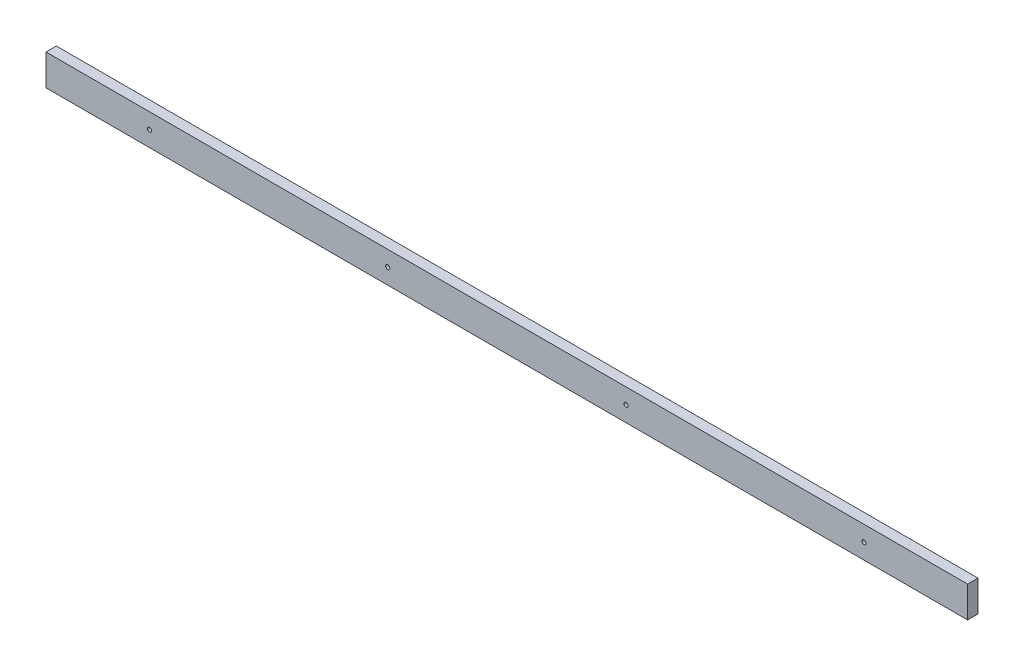
ISO-10303-21;
HEADER;
FILE_DESCRIPTION(('STEP AP214'),'2;1');
FILE_NAME('part.step','',(''),(''),'','','');
FILE_SCHEMA(('AUTOMOTIVE_DESIGN { 1 0 10303 214 1 1 1 1 }'));
ENDSEC;
DATA;
#1=APPLICATION_CONTEXT('core data for automotive mechanical design processes');
#2=APPLICATION_PROTOCOL_DEFINITION('international standard','automotive_design',2000,#1);
#3=PRODUCT_CONTEXT('',#1,'mechanical');
#4=PRODUCT('Part','Part','',(#3));
#5=PRODUCT_RELATED_PRODUCT_CATEGORY('part','',(#4));
#6=PRODUCT_DEFINITION_FORMATION('','',#4);
#7=PRODUCT_DEFINITION_CONTEXT('part definition',#1,'design');
#8=PRODUCT_DEFINITION('design','',#6,#7);
#9=PRODUCT_DEFINITION_SHAPE('','',#8);
#10=(LENGTH_UNIT() NAMED_UNIT(*) SI_UNIT(.MILLI.,.METRE.));
#11=(NAMED_UNIT(*) PLANE_ANGLE_UNIT() SI_UNIT($,.RADIAN.));
#12=(NAMED_UNIT(*) SI_UNIT($,.STERADIAN.) SOLID_ANGLE_UNIT());
#13=UNCERTAINTY_MEASURE_WITH_UNIT(LENGTH_MEASURE(1.E-05),#10,'distance_accuracy_value','');
#14=(GEOMETRIC_REPRESENTATION_CONTEXT(3) GLOBAL_UNCERTAINTY_ASSIGNED_CONTEXT((#13)) GLOBAL_UNIT_ASSIGNED_CONTEXT((#10,
#11,#12)) REPRESENTATION_CONTEXT('',''));
#15=CARTESIAN_POINT('',(0.,0.,0.));
#16=DIRECTION('',(0.,0.,1.));
#17=DIRECTION('',(1.,0.,0.));
#18=AXIS2_PLACEMENT_3D('',#15,#16,#17);
#19=CARTESIAN_POINT('',(890.000000000011,29.9999999999999,9.99999999999999));
#20=DIRECTION('',(-1.00000000000001,0.,0.));
#21=DIRECTION('',(0.,0.,1.));
#22=AXIS2_PLACEMENT_3D('',#19,#20,#21);
#23=PLANE('',#22);
#24=DIRECTION('',(0.,1.00000000000001,0.));
#25=VECTOR('',#24,1.);
#26=CARTESIAN_POINT('',(890.000000000011,29.9999999999999,-10.));
#27=LINE('',#26,#25);
#28=CARTESIAN_POINT('',(890.000000000013,-29.9999999999973,-10.));
#29=VERTEX_POINT('',#28);
#30=CARTESIAN_POINT('',(890.000000000011,29.9999999999999,-10.));
#31=VERTEX_POINT('',#30);
#32=EDGE_CURVE('E97',#29,#31,#27,.T.);
#33=ORIENTED_EDGE('',*,*,#32,.T.);
#34=DIRECTION('',(0.,0.,-1.));
#35=VECTOR('',#34,1.);
#36=CARTESIAN_POINT('',(890.000000000011,29.9999999999999,9.99999999999999));
#37=LINE('',#36,#35);
#38=CARTESIAN_POINT('',(890.000000000011,29.9999999999999,9.99999999999999));
#39=VERTEX_POINT('',#38);
#40=EDGE_CURVE('E11',#39,#31,#37,.T.);
#41=ORIENTED_EDGE('',*,*,#40,.F.);
#42=DIRECTION('',(0.,1.00000000000001,0.));
#43=VECTOR('',#42,1.);
#44=CARTESIAN_POINT('',(890.000000000011,29.9999999999999,9.99999999999999));
#45=LINE('',#44,#43);
#46=CARTESIAN_POINT('',(890.000000000013,-29.9999999999973,9.99999999999999));
#47=VERTEX_POINT('',#46);
#48=EDGE_CURVE('E85',#47,#39,#45,.T.);
#49=ORIENTED_EDGE('',*,*,#48,.F.);
#50=DIRECTION('',(0.,0.,-1.));
#51=VECTOR('',#50,1.);
#52=CARTESIAN_POINT('',(890.000000000013,-29.9999999999973,9.99999999999999));
#53=LINE('',#52,#51);
#54=EDGE_CURVE('E93',#47,#29,#53,.T.);
#55=ORIENTED_EDGE('',*,*,#54,.T.);
#56=EDGE_LOOP('',(#33,#41,#49,#55));
#57=FACE_BOUND('',#56,.T.);
#58=ADVANCED_FACE('F34',(#57),#23,.F.);
#59=CARTESIAN_POINT('',(-890.000000000013,30.,9.99999999999999));
#60=DIRECTION('',(0.,-1.00000000000001,0.));
#61=DIRECTION('',(0.,0.,-1.));
#62=AXIS2_PLACEMENT_3D('',#59,#60,#61);
#63=PLANE('',#62);
#64=DIRECTION('',(-1.00000000000001,0.,0.));
#65=VECTOR('',#64,1.);
#66=CARTESIAN_POINT('',(-890.000000000013,30.,-10.));
#67=LINE('',#66,#65);
#68=CARTESIAN_POINT('',(-890.000000000013,30.,-10.));
#69=VERTEX_POINT('',#68);
#70=EDGE_CURVE('E89',#31,#69,#67,.T.);
#71=ORIENTED_EDGE('',*,*,#70,.T.);
#72=DIRECTION('',(0.,0.,-1.));
#73=VECTOR('',#72,1.);
#74=CARTESIAN_POINT('',(-890.000000000013,30.,9.99999999999999));
#75=LINE('',#74,#73);
#76=CARTESIAN_POINT('',(-890.000000000013,30.,9.99999999999999));
#77=VERTEX_POINT('',#76);
#78=EDGE_CURVE('E42',#77,#69,#75,.T.);
#79=ORIENTED_EDGE('',*,*,#78,.F.);
#80=DIRECTION('',(-1.00000000000001,0.,0.));
#81=VECTOR('',#80,1.);
#82=CARTESIAN_POINT('',(-890.000000000013,30.,9.99999999999999));
#83=LINE('',#82,#81);
#84=EDGE_CURVE('E80',#39,#77,#83,.T.);
#85=ORIENTED_EDGE('',*,*,#84,.F.);
#86=ORIENTED_EDGE('',*,*,#40,.T.);
#87=EDGE_LOOP('',(#71,#79,#85,#86));
#88=FACE_BOUND('',#87,.T.);
#89=ADVANCED_FACE('F88',(#88),#63,.F.);
#90=CARTESIAN_POINT('',(-890.000000000013,30.,9.99999999999999));
#91=DIRECTION('',(1.00000000000001,0.,0.));
#92=DIRECTION('',(0.,0.,-1.));
#93=AXIS2_PLACEMENT_3D('',#90,#91,#92);
#94=PLANE('',#93);
#95=DIRECTION('',(0.,-1.00000000000001,0.));
#96=VECTOR('',#95,1.);
#97=CARTESIAN_POINT('',(-890.000000000013,30.,-10.));
#98=LINE('',#97,#96);
#99=CARTESIAN_POINT('',(-890.000000000011,-30.0000000000028,-10.));
#100=VERTEX_POINT('',#99);
#101=EDGE_CURVE('E67',#69,#100,#98,.T.);
#102=ORIENTED_EDGE('',*,*,#101,.T.);
#103=DIRECTION('',(0.,0.,-1.));
#104=VECTOR('',#103,1.);
#105=CARTESIAN_POINT('',(-890.000000000011,-30.0000000000028,9.99999999999999));
#106=LINE('',#105,#104);
#107=CARTESIAN_POINT('',(-890.000000000011,-30.0000000000028,9.99999999999999));
#108=VERTEX_POINT('',#107);
#109=EDGE_CURVE('E90',#108,#100,#106,.T.);
#110=ORIENTED_EDGE('',*,*,#109,.F.);
#111=DIRECTION('',(0.,-1.00000000000001,0.));
#112=VECTOR('',#111,1.);
#113=CARTESIAN_POINT('',(-890.000000000013,30.,9.99999999999999));
#114=LINE('',#113,#112);
#115=EDGE_CURVE('E83',#77,#108,#114,.T.);
#116=ORIENTED_EDGE('',*,*,#115,.F.);
#117=ORIENTED_EDGE('',*,*,#78,.T.);
#118=EDGE_LOOP('',(#102,#110,#116,#117));
#119=FACE_BOUND('',#118,.T.);
#120=ADVANCED_FACE('F91',(#119),#94,.F.);
#121=CARTESIAN_POINT('',(-890.000000000011,-30.0000000000028,9.99999999999999));
#122=DIRECTION('',(0.,1.00000000000001,0.));
#123=DIRECTION('',(0.,0.,1.));
#124=AXIS2_PLACEMENT_3D('',#121,#122,#123);
#125=PLANE('',#124);
#126=DIRECTION('',(1.00000000000001,0.,0.));
#127=VECTOR('',#126,1.);
#128=CARTESIAN_POINT('',(-890.000000000011,-30.0000000000028,-10.));
#129=LINE('',#128,#127);
#130=EDGE_CURVE('E73',#100,#29,#129,.T.);
#131=ORIENTED_EDGE('',*,*,#130,.T.);
#132=ORIENTED_EDGE('',*,*,#54,.F.);
#133=DIRECTION('',(1.00000000000001,0.,0.));
#134=VECTOR('',#133,1.);
#135=CARTESIAN_POINT('',(-890.000000000011,-30.0000000000028,9.99999999999999));
#136=LINE('',#135,#134);
#137=EDGE_CURVE('E50',#108,#47,#136,.T.);
#138=ORIENTED_EDGE('',*,*,#137,.F.);
#139=ORIENTED_EDGE('',*,*,#109,.T.);
#140=EDGE_LOOP('',(#131,#132,#138,#139));
#141=FACE_BOUND('',#140,.T.);
#142=ADVANCED_FACE('F105',(#141),#125,.F.);
#143=CARTESIAN_POINT('',(0.,0.,9.99999999999999));
#144=DIRECTION('',(0.,0.,1.));
#145=DIRECTION('',(1.00000000000001,0.,0.));
#146=AXIS2_PLACEMENT_3D('',#143,#144,#145);
#147=PLANE('',#146);
#148=CARTESIAN_POINT('',(-690.000000000007,0.,9.99999999999999));
#149=DIRECTION('',(0.,0.,1.));
#150=DIRECTION('',(1.00000000000001,0.,0.));
#151=AXIS2_PLACEMENT_3D('',#148,#149,#150);
#152=CIRCLE('',#151,3.99999999999999);
#153=CARTESIAN_POINT('',(-686.000000000007,0.,9.99999999999999));
#154=VERTEX_POINT('',#153);
#155=EDGE_CURVE('E127',#154,#154,#152,.T.);
#156=ORIENTED_EDGE('',*,*,#155,.F.);
#157=EDGE_LOOP('',(#156));
#158=FACE_BOUND('',#157,.T.);
#159=CARTESIAN_POINT('',(-230.000000000002,0.,9.99999999999999));
#160=DIRECTION('',(0.,0.,1.));
#161=DIRECTION('',(1.00000000000001,0.,0.));
#162=AXIS2_PLACEMENT_3D('',#159,#160,#161);
#163=CIRCLE('',#162,3.99999999999999);
#164=CARTESIAN_POINT('',(-226.000000000002,0.,9.99999999999999));
#165=VERTEX_POINT('',#164);
#166=EDGE_CURVE('E121',#165,#165,#163,.T.);
#167=ORIENTED_EDGE('',*,*,#166,.F.);
#168=EDGE_LOOP('',(#167));
#169=FACE_BOUND('',#168,.T.);
#170=CARTESIAN_POINT('',(230.000000000002,0.,9.99999999999999));
#171=DIRECTION('',(0.,0.,1.));
#172=DIRECTION('',(-1.00000000000001,0.,0.));
#173=AXIS2_PLACEMENT_3D('',#170,#171,#172);
#174=CIRCLE('',#173,3.99999999999999);
#175=CARTESIAN_POINT('',(226.000000000002,0.,9.99999999999999));
#176=VERTEX_POINT('',#175);
#177=EDGE_CURVE('E114',#176,#176,#174,.T.);
#178=ORIENTED_EDGE('',*,*,#177,.F.);
#179=EDGE_LOOP('',(#178));
#180=FACE_BOUND('',#179,.T.);
#181=CARTESIAN_POINT('',(690.000000000004,0.,9.99999999999999));
#182=DIRECTION('',(0.,0.,1.));
#183=DIRECTION('',(-1.00000000000001,0.,0.));
#184=AXIS2_PLACEMENT_3D('',#181,#182,#183);
#185=CIRCLE('',#184,3.99999999999999);
#186=CARTESIAN_POINT('',(686.000000000004,0.,9.99999999999999));
#187=VERTEX_POINT('',#186);
#188=EDGE_CURVE('E115',#187,#187,#185,.T.);
#189=ORIENTED_EDGE('',*,*,#188,.F.);
#190=EDGE_LOOP('',(#189));
#191=FACE_BOUND('',#190,.T.);
#192=ORIENTED_EDGE('',*,*,#48,.T.);
#193=ORIENTED_EDGE('',*,*,#84,.T.);
#194=ORIENTED_EDGE('',*,*,#115,.T.);
#195=ORIENTED_EDGE('',*,*,#137,.T.);
#196=EDGE_LOOP('',(#192,#193,#194,#195));
#197=FACE_BOUND('',#196,.T.);
#198=ADVANCED_FACE('F81',(#158,#169,#180,#191,#197),#147,.T.);
#199=CARTESIAN_POINT('',(0.,0.,-10.));
#200=DIRECTION('',(0.,0.,1.));
#201=DIRECTION('',(1.00000000000001,0.,0.));
#202=AXIS2_PLACEMENT_3D('',#199,#200,#201);
#203=PLANE('',#202);
#204=CARTESIAN_POINT('',(-690.000000000007,0.,-10.));
#205=DIRECTION('',(0.,0.,1.));
#206=DIRECTION('',(1.00000000000001,0.,0.));
#207=AXIS2_PLACEMENT_3D('',#204,#205,#206);
#208=CIRCLE('',#207,3.99999999999999);
#209=CARTESIAN_POINT('',(-686.000000000007,0.,-10.));
#210=VERTEX_POINT('',#209);
#211=EDGE_CURVE('E100',#210,#210,#208,.T.);
#212=ORIENTED_EDGE('',*,*,#211,.T.);
#213=EDGE_LOOP('',(#212));
#214=FACE_BOUND('',#213,.T.);
#215=CARTESIAN_POINT('',(-230.000000000002,0.,-10.));
#216=DIRECTION('',(0.,0.,1.));
#217=DIRECTION('',(1.00000000000001,0.,0.));
#218=AXIS2_PLACEMENT_3D('',#215,#216,#217);
#219=CIRCLE('',#218,3.99999999999999);
#220=CARTESIAN_POINT('',(-226.000000000002,0.,-10.));
#221=VERTEX_POINT('',#220);
#222=EDGE_CURVE('E124',#221,#221,#219,.T.);
#223=ORIENTED_EDGE('',*,*,#222,.T.);
#224=EDGE_LOOP('',(#223));
#225=FACE_BOUND('',#224,.T.);
#226=CARTESIAN_POINT('',(230.000000000002,0.,-10.));
#227=DIRECTION('',(0.,0.,1.));
#228=DIRECTION('',(-1.00000000000001,0.,0.));
#229=AXIS2_PLACEMENT_3D('',#226,#227,#228);
#230=CIRCLE('',#229,3.99999999999999);
#231=CARTESIAN_POINT('',(226.000000000002,0.,-10.));
#232=VERTEX_POINT('',#231);
#233=EDGE_CURVE('E118',#232,#232,#230,.T.);
#234=ORIENTED_EDGE('',*,*,#233,.T.);
#235=EDGE_LOOP('',(#234));
#236=FACE_BOUND('',#235,.T.);
#237=CARTESIAN_POINT('',(690.000000000004,0.,-10.));
#238=DIRECTION('',(0.,0.,1.));
#239=DIRECTION('',(-1.00000000000001,0.,0.));
#240=AXIS2_PLACEMENT_3D('',#237,#238,#239);
#241=CIRCLE('',#240,3.99999999999999);
#242=CARTESIAN_POINT('',(686.000000000004,0.,-10.));
#243=VERTEX_POINT('',#242);
#244=EDGE_CURVE('E111',#243,#243,#241,.T.);
#245=ORIENTED_EDGE('',*,*,#244,.T.);
#246=EDGE_LOOP('',(#245));
#247=FACE_BOUND('',#246,.T.);
#248=ORIENTED_EDGE('',*,*,#32,.F.);
#249=ORIENTED_EDGE('',*,*,#130,.F.);
#250=ORIENTED_EDGE('',*,*,#101,.F.);
#251=ORIENTED_EDGE('',*,*,#70,.F.);
#252=EDGE_LOOP('',(#248,#249,#250,#251));
#253=FACE_BOUND('',#252,.T.);
#254=ADVANCED_FACE('F108',(#214,#225,#236,#247,#253),#203,.F.);
#255=CARTESIAN_POINT('',(690.000000000004,0.,-10.));
#256=DIRECTION('',(0.,0.,1.));
#257=DIRECTION('',(1.00000000000001,0.,0.));
#258=AXIS2_PLACEMENT_3D('',#255,#256,#257);
#259=CYLINDRICAL_SURFACE('',#258,3.99999999999999);
#260=ORIENTED_EDGE('',*,*,#244,.F.);
#261=EDGE_LOOP('',(#260));
#262=FACE_BOUND('',#261,.T.);
#263=ORIENTED_EDGE('',*,*,#188,.T.);
#264=EDGE_LOOP('',(#263));
#265=FACE_BOUND('',#264,.T.);
#266=ADVANCED_FACE('F146',(#262,#265),#259,.F.);
#267=CARTESIAN_POINT('',(230.000000000002,0.,-10.));
#268=DIRECTION('',(0.,0.,1.));
#269=DIRECTION('',(1.00000000000001,0.,0.));
#270=AXIS2_PLACEMENT_3D('',#267,#268,#269);
#271=CYLINDRICAL_SURFACE('',#270,3.99999999999999);
#272=ORIENTED_EDGE('',*,*,#233,.F.);
#273=EDGE_LOOP('',(#272));
#274=FACE_BOUND('',#273,.T.);
#275=ORIENTED_EDGE('',*,*,#177,.T.);
#276=EDGE_LOOP('',(#275));
#277=FACE_BOUND('',#276,.T.);
#278=ADVANCED_FACE('F148',(#274,#277),#271,.F.);
#279=CARTESIAN_POINT('',(-230.000000000002,0.,-10.));
#280=DIRECTION('',(0.,0.,1.));
#281=DIRECTION('',(1.00000000000001,0.,0.));
#282=AXIS2_PLACEMENT_3D('',#279,#280,#281);
#283=CYLINDRICAL_SURFACE('',#282,3.99999999999999);
#284=ORIENTED_EDGE('',*,*,#222,.F.);
#285=EDGE_LOOP('',(#284));
#286=FACE_BOUND('',#285,.T.);
#287=ORIENTED_EDGE('',*,*,#166,.T.);
#288=EDGE_LOOP('',(#287));
#289=FACE_BOUND('',#288,.T.);
#290=ADVANCED_FACE('F155',(#286,#289),#283,.F.);
#291=CARTESIAN_POINT('',(-690.000000000007,0.,-10.));
#292=DIRECTION('',(0.,0.,1.));
#293=DIRECTION('',(1.00000000000001,0.,0.));
#294=AXIS2_PLACEMENT_3D('',#291,#292,#293);
#295=CYLINDRICAL_SURFACE('',#294,3.99999999999999);
#296=ORIENTED_EDGE('',*,*,#211,.F.);
#297=EDGE_LOOP('',(#296));
#298=FACE_BOUND('',#297,.T.);
#299=ORIENTED_EDGE('',*,*,#155,.T.);
#300=EDGE_LOOP('',(#299));
#301=FACE_BOUND('',#300,.T.);
#302=ADVANCED_FACE('F135',(#298,#301),#295,.F.);
#303=CLOSED_SHELL('',(#58,#89,#120,#142,#198,#254,#266,#278,#290,#302));
#304=MANIFOLD_SOLID_BREP('B2',#303);
#305=ADVANCED_BREP_SHAPE_REPRESENTATION('',(#18,#304),#14);
#306=SHAPE_DEFINITION_REPRESENTATION(#9,#305);
ENDSEC;
END-ISO-10303-21;
